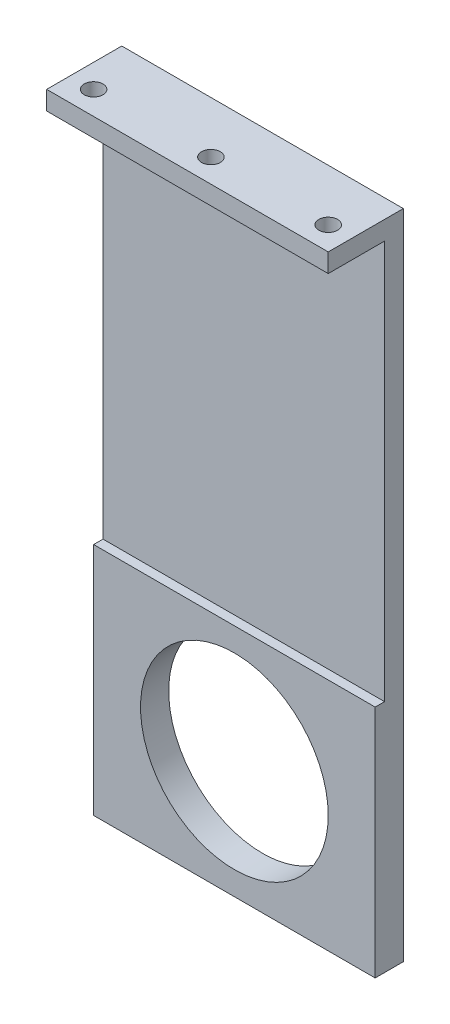
ISO-10303-21;
HEADER;
FILE_DESCRIPTION(('STEP AP214'),'2;1');
FILE_NAME('part.step','',(''),(''),'','','');
FILE_SCHEMA(('AUTOMOTIVE_DESIGN { 1 0 10303 214 1 1 1 1 }'));
ENDSEC;
DATA;
#1=APPLICATION_CONTEXT('core data for automotive mechanical design processes');
#2=APPLICATION_PROTOCOL_DEFINITION('international standard','automotive_design',2000,#1);
#3=PRODUCT_CONTEXT('',#1,'mechanical');
#4=PRODUCT('Part','Part','',(#3));
#5=PRODUCT_RELATED_PRODUCT_CATEGORY('part','',(#4));
#6=PRODUCT_DEFINITION_FORMATION('','',#4);
#7=PRODUCT_DEFINITION_CONTEXT('part definition',#1,'design');
#8=PRODUCT_DEFINITION('design','',#6,#7);
#9=PRODUCT_DEFINITION_SHAPE('','',#8);
#10=(LENGTH_UNIT() NAMED_UNIT(*) SI_UNIT(.MILLI.,.METRE.));
#11=(NAMED_UNIT(*) PLANE_ANGLE_UNIT() SI_UNIT($,.RADIAN.));
#12=(NAMED_UNIT(*) SI_UNIT($,.STERADIAN.) SOLID_ANGLE_UNIT());
#13=UNCERTAINTY_MEASURE_WITH_UNIT(LENGTH_MEASURE(1.E-05),#10,'distance_accuracy_value','');
#14=(GEOMETRIC_REPRESENTATION_CONTEXT(3) GLOBAL_UNCERTAINTY_ASSIGNED_CONTEXT((#13)) GLOBAL_UNIT_ASSIGNED_CONTEXT((#10,
#11,#12)) REPRESENTATION_CONTEXT('',''));
#15=CARTESIAN_POINT('',(0.,0.,0.));
#16=DIRECTION('',(0.,0.,1.));
#17=DIRECTION('',(1.,0.,0.));
#18=AXIS2_PLACEMENT_3D('',#15,#16,#17);
#19=CARTESIAN_POINT('',(-30.,0.,6.));
#20=DIRECTION('',(-1.,0.,0.));
#21=DIRECTION('',(0.,0.,1.));
#22=AXIS2_PLACEMENT_3D('',#19,#20,#21);
#23=PLANE('',#22);
#24=DIRECTION('',(0.,1.,0.));
#25=VECTOR('',#24,1.);
#26=CARTESIAN_POINT('',(-30.,0.,0.));
#27=LINE('',#26,#25);
#28=CARTESIAN_POINT('',(-30.,-25.,0.));
#29=VERTEX_POINT('',#28);
#30=CARTESIAN_POINT('',(-30.,114.,0.));
#31=VERTEX_POINT('',#30);
#32=EDGE_CURVE('E184',#29,#31,#27,.T.);
#33=ORIENTED_EDGE('',*,*,#32,.F.);
#34=DIRECTION('',(0.,0.,-1.));
#35=VECTOR('',#34,1.);
#36=CARTESIAN_POINT('',(-30.,-25.,6.));
#37=LINE('',#36,#35);
#38=CARTESIAN_POINT('',(-30.,-25.,6.));
#39=VERTEX_POINT('',#38);
#40=EDGE_CURVE('E11',#39,#29,#37,.T.);
#41=ORIENTED_EDGE('',*,*,#40,.F.);
#42=DIRECTION('',(0.,1.,0.));
#43=VECTOR('',#42,1.);
#44=CARTESIAN_POINT('',(-30.,0.,6.));
#45=LINE('',#44,#43);
#46=CARTESIAN_POINT('',(-30.,25.,6.));
#47=VERTEX_POINT('',#46);
#48=EDGE_CURVE('E167',#39,#47,#45,.T.);
#49=ORIENTED_EDGE('',*,*,#48,.T.);
#50=DIRECTION('',(0.,0.,-1.));
#51=VECTOR('',#50,1.);
#52=CARTESIAN_POINT('',(-30.,25.,6.));
#53=LINE('',#52,#51);
#54=CARTESIAN_POINT('',(-30.,25.,4.));
#55=VERTEX_POINT('',#54);
#56=EDGE_CURVE('E180',#47,#55,#53,.T.);
#57=ORIENTED_EDGE('',*,*,#56,.T.);
#58=DIRECTION('',(0.,1.,0.));
#59=VECTOR('',#58,1.);
#60=CARTESIAN_POINT('',(-30.,0.,4.));
#61=LINE('',#60,#59);
#62=CARTESIAN_POINT('',(-30.,110.,4.));
#63=VERTEX_POINT('',#62);
#64=EDGE_CURVE('E61',#55,#63,#61,.T.);
#65=ORIENTED_EDGE('',*,*,#64,.T.);
#66=DIRECTION('',(0.,0.,1.));
#67=VECTOR('',#66,1.);
#68=CARTESIAN_POINT('',(-30.,110.,0.));
#69=LINE('',#68,#67);
#70=CARTESIAN_POINT('',(-30.,110.,16.));
#71=VERTEX_POINT('',#70);
#72=EDGE_CURVE('E142',#63,#71,#69,.T.);
#73=ORIENTED_EDGE('',*,*,#72,.T.);
#74=DIRECTION('',(0.,-1.,0.));
#75=VECTOR('',#74,1.);
#76=CARTESIAN_POINT('',(-30.,114.,16.));
#77=LINE('',#76,#75);
#78=CARTESIAN_POINT('',(-30.,114.,16.));
#79=VERTEX_POINT('',#78);
#80=EDGE_CURVE('E122',#79,#71,#77,.T.);
#81=ORIENTED_EDGE('',*,*,#80,.F.);
#82=DIRECTION('',(0.,0.,1.));
#83=VECTOR('',#82,1.);
#84=CARTESIAN_POINT('',(-30.,114.,0.));
#85=LINE('',#84,#83);
#86=EDGE_CURVE('E130',#31,#79,#85,.T.);
#87=ORIENTED_EDGE('',*,*,#86,.F.);
#88=EDGE_LOOP('',(#33,#41,#49,#57,#65,#73,#81,#87));
#89=FACE_BOUND('',#88,.T.);
#90=ADVANCED_FACE('F45',(#89),#23,.T.);
#91=CARTESIAN_POINT('',(0.,-25.,6.));
#92=DIRECTION('',(0.,-1.,0.));
#93=DIRECTION('',(1.,0.,0.));
#94=AXIS2_PLACEMENT_3D('',#91,#92,#93);
#95=PLANE('',#94);
#96=DIRECTION('',(-1.,0.,0.));
#97=VECTOR('',#96,1.);
#98=CARTESIAN_POINT('',(0.,-25.,0.));
#99=LINE('',#98,#97);
#100=CARTESIAN_POINT('',(30.,-25.,0.));
#101=VERTEX_POINT('',#100);
#102=EDGE_CURVE('E187',#101,#29,#99,.T.);
#103=ORIENTED_EDGE('',*,*,#102,.F.);
#104=DIRECTION('',(0.,0.,-1.));
#105=VECTOR('',#104,1.);
#106=CARTESIAN_POINT('',(30.,-25.,6.));
#107=LINE('',#106,#105);
#108=CARTESIAN_POINT('',(30.,-25.,6.));
#109=VERTEX_POINT('',#108);
#110=EDGE_CURVE('E54',#109,#101,#107,.T.);
#111=ORIENTED_EDGE('',*,*,#110,.F.);
#112=DIRECTION('',(-1.,0.,0.));
#113=VECTOR('',#112,1.);
#114=CARTESIAN_POINT('',(0.,-25.,6.));
#115=LINE('',#114,#113);
#116=EDGE_CURVE('E171',#109,#39,#115,.T.);
#117=ORIENTED_EDGE('',*,*,#116,.T.);
#118=ORIENTED_EDGE('',*,*,#40,.T.);
#119=EDGE_LOOP('',(#103,#111,#117,#118));
#120=FACE_BOUND('',#119,.T.);
#121=ADVANCED_FACE('F224',(#120),#95,.T.);
#122=CARTESIAN_POINT('',(30.,0.,6.));
#123=DIRECTION('',(-1.,0.,0.));
#124=DIRECTION('',(0.,0.,1.));
#125=AXIS2_PLACEMENT_3D('',#122,#123,#124);
#126=PLANE('',#125);
#127=DIRECTION('',(0.,1.,0.));
#128=VECTOR('',#127,1.);
#129=CARTESIAN_POINT('',(30.,0.,0.));
#130=LINE('',#129,#128);
#131=CARTESIAN_POINT('',(30.,114.,0.));
#132=VERTEX_POINT('',#131);
#133=EDGE_CURVE('E168',#101,#132,#130,.T.);
#134=ORIENTED_EDGE('',*,*,#133,.T.);
#135=DIRECTION('',(0.,0.,-1.));
#136=VECTOR('',#135,1.);
#137=CARTESIAN_POINT('',(30.,114.,0.));
#138=LINE('',#137,#136);
#139=CARTESIAN_POINT('',(30.,114.,16.));
#140=VERTEX_POINT('',#139);
#141=EDGE_CURVE('E129',#140,#132,#138,.T.);
#142=ORIENTED_EDGE('',*,*,#141,.F.);
#143=DIRECTION('',(0.,-1.,0.));
#144=VECTOR('',#143,1.);
#145=CARTESIAN_POINT('',(30.,114.,16.));
#146=LINE('',#145,#144);
#147=CARTESIAN_POINT('',(30.,110.,16.));
#148=VERTEX_POINT('',#147);
#149=EDGE_CURVE('E124',#140,#148,#146,.T.);
#150=ORIENTED_EDGE('',*,*,#149,.T.);
#151=DIRECTION('',(0.,0.,-1.));
#152=VECTOR('',#151,1.);
#153=CARTESIAN_POINT('',(30.,110.,0.));
#154=LINE('',#153,#152);
#155=CARTESIAN_POINT('',(30.,110.,4.));
#156=VERTEX_POINT('',#155);
#157=EDGE_CURVE('E139',#148,#156,#154,.T.);
#158=ORIENTED_EDGE('',*,*,#157,.T.);
#159=DIRECTION('',(0.,1.,0.));
#160=VECTOR('',#159,1.);
#161=CARTESIAN_POINT('',(30.,0.,4.));
#162=LINE('',#161,#160);
#163=CARTESIAN_POINT('',(30.,25.,4.));
#164=VERTEX_POINT('',#163);
#165=EDGE_CURVE('E149',#164,#156,#162,.T.);
#166=ORIENTED_EDGE('',*,*,#165,.F.);
#167=DIRECTION('',(0.,0.,-1.));
#168=VECTOR('',#167,1.);
#169=CARTESIAN_POINT('',(30.,25.,6.));
#170=LINE('',#169,#168);
#171=CARTESIAN_POINT('',(30.,25.,6.));
#172=VERTEX_POINT('',#171);
#173=EDGE_CURVE('E196',#172,#164,#170,.T.);
#174=ORIENTED_EDGE('',*,*,#173,.F.);
#175=DIRECTION('',(0.,1.,0.));
#176=VECTOR('',#175,1.);
#177=CARTESIAN_POINT('',(30.,0.,6.));
#178=LINE('',#177,#176);
#179=EDGE_CURVE('E175',#109,#172,#178,.T.);
#180=ORIENTED_EDGE('',*,*,#179,.F.);
#181=ORIENTED_EDGE('',*,*,#110,.T.);
#182=EDGE_LOOP('',(#134,#142,#150,#158,#166,#174,#180,#181));
#183=FACE_BOUND('',#182,.T.);
#184=ADVANCED_FACE('F203',(#183),#126,.F.);
#185=CARTESIAN_POINT('',(0.,0.,6.));
#186=DIRECTION('',(0.,0.,-1.));
#187=DIRECTION('',(-1.,0.,0.));
#188=AXIS2_PLACEMENT_3D('',#185,#186,#187);
#189=CYLINDRICAL_SURFACE('',#188,20.);
#190=CARTESIAN_POINT('',(0.,0.,6.));
#191=DIRECTION('',(0.,0.,1.));
#192=DIRECTION('',(1.,0.,0.));
#193=AXIS2_PLACEMENT_3D('',#190,#191,#192);
#194=CIRCLE('',#193,20.);
#195=CARTESIAN_POINT('',(20.,0.,6.));
#196=VERTEX_POINT('',#195);
#197=EDGE_CURVE('E163',#196,#196,#194,.T.);
#198=ORIENTED_EDGE('',*,*,#197,.T.);
#199=EDGE_LOOP('',(#198));
#200=FACE_BOUND('',#199,.T.);
#201=CARTESIAN_POINT('',(0.,0.,0.));
#202=DIRECTION('',(0.,0.,1.));
#203=DIRECTION('',(1.,0.,0.));
#204=AXIS2_PLACEMENT_3D('',#201,#202,#203);
#205=CIRCLE('',#204,20.);
#206=CARTESIAN_POINT('',(20.,0.,0.));
#207=VERTEX_POINT('',#206);
#208=EDGE_CURVE('E162',#207,#207,#205,.T.);
#209=ORIENTED_EDGE('',*,*,#208,.F.);
#210=EDGE_LOOP('',(#209));
#211=FACE_BOUND('',#210,.T.);
#212=ADVANCED_FACE('F47',(#200,#211),#189,.F.);
#213=CARTESIAN_POINT('',(0.,25.,6.));
#214=DIRECTION('',(0.,-1.,0.));
#215=DIRECTION('',(0.,0.,-1.));
#216=AXIS2_PLACEMENT_3D('',#213,#214,#215);
#217=PLANE('',#216);
#218=ORIENTED_EDGE('',*,*,#173,.T.);
#219=DIRECTION('',(-1.,0.,0.));
#220=VECTOR('',#219,1.);
#221=CARTESIAN_POINT('',(0.,25.,4.));
#222=LINE('',#221,#220);
#223=EDGE_CURVE('E145',#164,#55,#222,.T.);
#224=ORIENTED_EDGE('',*,*,#223,.T.);
#225=ORIENTED_EDGE('',*,*,#56,.F.);
#226=DIRECTION('',(-1.,0.,0.));
#227=VECTOR('',#226,1.);
#228=CARTESIAN_POINT('',(0.,25.,6.));
#229=LINE('',#228,#227);
#230=EDGE_CURVE('E70',#172,#47,#229,.T.);
#231=ORIENTED_EDGE('',*,*,#230,.F.);
#232=EDGE_LOOP('',(#218,#224,#225,#231));
#233=FACE_BOUND('',#232,.T.);
#234=ADVANCED_FACE('F202',(#233),#217,.F.);
#235=CARTESIAN_POINT('',(0.,0.,6.));
#236=DIRECTION('',(0.,0.,1.));
#237=DIRECTION('',(1.,0.,0.));
#238=AXIS2_PLACEMENT_3D('',#235,#236,#237);
#239=PLANE('',#238);
#240=ORIENTED_EDGE('',*,*,#197,.F.);
#241=EDGE_LOOP('',(#240));
#242=FACE_BOUND('',#241,.T.);
#243=ORIENTED_EDGE('',*,*,#48,.F.);
#244=ORIENTED_EDGE('',*,*,#116,.F.);
#245=ORIENTED_EDGE('',*,*,#179,.T.);
#246=ORIENTED_EDGE('',*,*,#230,.T.);
#247=EDGE_LOOP('',(#243,#244,#245,#246));
#248=FACE_BOUND('',#247,.T.);
#249=ADVANCED_FACE('F218',(#242,#248),#239,.T.);
#250=CARTESIAN_POINT('',(0.,0.,0.));
#251=DIRECTION('',(0.,0.,1.));
#252=DIRECTION('',(1.,0.,0.));
#253=AXIS2_PLACEMENT_3D('',#250,#251,#252);
#254=PLANE('',#253);
#255=ORIENTED_EDGE('',*,*,#208,.T.);
#256=EDGE_LOOP('',(#255));
#257=FACE_BOUND('',#256,.T.);
#258=ORIENTED_EDGE('',*,*,#32,.T.);
#259=DIRECTION('',(-1.,0.,0.));
#260=VECTOR('',#259,1.);
#261=CARTESIAN_POINT('',(-30.,114.,0.));
#262=LINE('',#261,#260);
#263=EDGE_CURVE('E137',#132,#31,#262,.T.);
#264=ORIENTED_EDGE('',*,*,#263,.F.);
#265=ORIENTED_EDGE('',*,*,#133,.F.);
#266=ORIENTED_EDGE('',*,*,#102,.T.);
#267=EDGE_LOOP('',(#258,#264,#265,#266));
#268=FACE_BOUND('',#267,.T.);
#269=ADVANCED_FACE('F210',(#257,#268),#254,.F.);
#270=CARTESIAN_POINT('',(0.,0.,4.));
#271=DIRECTION('',(0.,0.,1.));
#272=DIRECTION('',(1.,0.,0.));
#273=AXIS2_PLACEMENT_3D('',#270,#271,#272);
#274=PLANE('',#273);
#275=ORIENTED_EDGE('',*,*,#223,.F.);
#276=ORIENTED_EDGE('',*,*,#165,.T.);
#277=DIRECTION('',(1.,0.,0.));
#278=VECTOR('',#277,1.);
#279=CARTESIAN_POINT('',(0.,110.,4.));
#280=LINE('',#279,#278);
#281=EDGE_CURVE('E156',#63,#156,#280,.T.);
#282=ORIENTED_EDGE('',*,*,#281,.F.);
#283=ORIENTED_EDGE('',*,*,#64,.F.);
#284=EDGE_LOOP('',(#275,#276,#282,#283));
#285=FACE_BOUND('',#284,.T.);
#286=ADVANCED_FACE('F207',(#285),#274,.T.);
#287=CARTESIAN_POINT('',(0.,110.,0.));
#288=DIRECTION('',(0.,1.,0.));
#289=DIRECTION('',(0.,0.,1.));
#290=AXIS2_PLACEMENT_3D('',#287,#288,#289);
#291=PLANE('',#290);
#292=CARTESIAN_POINT('',(-25.,110.,11.));
#293=DIRECTION('',(0.,1.,0.));
#294=DIRECTION('',(0.,0.,1.));
#295=AXIS2_PLACEMENT_3D('',#292,#293,#294);
#296=CIRCLE('',#295,2.);
#297=CARTESIAN_POINT('',(-25.,110.,13.));
#298=VERTEX_POINT('',#297);
#299=EDGE_CURVE('E255',#298,#298,#296,.T.);
#300=ORIENTED_EDGE('',*,*,#299,.T.);
#301=EDGE_LOOP('',(#300));
#302=FACE_BOUND('',#301,.T.);
#303=CARTESIAN_POINT('',(0.,110.,11.));
#304=DIRECTION('',(0.,1.,0.));
#305=DIRECTION('',(0.,0.,1.));
#306=AXIS2_PLACEMENT_3D('',#303,#304,#305);
#307=CIRCLE('',#306,2.);
#308=CARTESIAN_POINT('',(0.,110.,13.));
#309=VERTEX_POINT('',#308);
#310=EDGE_CURVE('E263',#309,#309,#307,.T.);
#311=ORIENTED_EDGE('',*,*,#310,.T.);
#312=EDGE_LOOP('',(#311));
#313=FACE_BOUND('',#312,.T.);
#314=CARTESIAN_POINT('',(25.,110.,11.));
#315=DIRECTION('',(0.,1.,0.));
#316=DIRECTION('',(0.,0.,1.));
#317=AXIS2_PLACEMENT_3D('',#314,#315,#316);
#318=CIRCLE('',#317,2.);
#319=CARTESIAN_POINT('',(25.,110.,13.));
#320=VERTEX_POINT('',#319);
#321=EDGE_CURVE('E271',#320,#320,#318,.T.);
#322=ORIENTED_EDGE('',*,*,#321,.T.);
#323=EDGE_LOOP('',(#322));
#324=FACE_BOUND('',#323,.T.);
#325=ORIENTED_EDGE('',*,*,#72,.F.);
#326=ORIENTED_EDGE('',*,*,#281,.T.);
#327=ORIENTED_EDGE('',*,*,#157,.F.);
#328=DIRECTION('',(1.,0.,0.));
#329=VECTOR('',#328,1.);
#330=CARTESIAN_POINT('',(-30.,110.,16.));
#331=LINE('',#330,#329);
#332=EDGE_CURVE('E248',#71,#148,#331,.T.);
#333=ORIENTED_EDGE('',*,*,#332,.F.);
#334=EDGE_LOOP('',(#325,#326,#327,#333));
#335=FACE_BOUND('',#334,.T.);
#336=ADVANCED_FACE('F209',(#302,#313,#324,#335),#291,.F.);
#337=CARTESIAN_POINT('',(0.,114.,0.));
#338=DIRECTION('',(0.,1.,0.));
#339=DIRECTION('',(0.,0.,1.));
#340=AXIS2_PLACEMENT_3D('',#337,#338,#339);
#341=PLANE('',#340);
#342=CARTESIAN_POINT('',(0.,114.,11.));
#343=DIRECTION('',(0.,1.,0.));
#344=DIRECTION('',(0.,0.,1.));
#345=AXIS2_PLACEMENT_3D('',#342,#343,#344);
#346=CIRCLE('',#345,2.);
#347=CARTESIAN_POINT('',(0.,114.,13.));
#348=VERTEX_POINT('',#347);
#349=EDGE_CURVE('E259',#348,#348,#346,.T.);
#350=ORIENTED_EDGE('',*,*,#349,.F.);
#351=EDGE_LOOP('',(#350));
#352=FACE_BOUND('',#351,.T.);
#353=ORIENTED_EDGE('',*,*,#86,.T.);
#354=DIRECTION('',(1.,0.,0.));
#355=VECTOR('',#354,1.);
#356=CARTESIAN_POINT('',(-30.,114.,16.));
#357=LINE('',#356,#355);
#358=EDGE_CURVE('E118',#79,#140,#357,.T.);
#359=ORIENTED_EDGE('',*,*,#358,.T.);
#360=ORIENTED_EDGE('',*,*,#141,.T.);
#361=ORIENTED_EDGE('',*,*,#263,.T.);
#362=EDGE_LOOP('',(#353,#359,#360,#361));
#363=FACE_BOUND('',#362,.T.);
#364=CARTESIAN_POINT('',(-25.,114.,11.));
#365=DIRECTION('',(0.,1.,0.));
#366=DIRECTION('',(0.,0.,1.));
#367=AXIS2_PLACEMENT_3D('',#364,#365,#366);
#368=CIRCLE('',#367,2.);
#369=CARTESIAN_POINT('',(-25.,114.,13.));
#370=VERTEX_POINT('',#369);
#371=EDGE_CURVE('E249',#370,#370,#368,.T.);
#372=ORIENTED_EDGE('',*,*,#371,.F.);
#373=EDGE_LOOP('',(#372));
#374=FACE_BOUND('',#373,.T.);
#375=CARTESIAN_POINT('',(25.,114.,11.));
#376=DIRECTION('',(0.,1.,0.));
#377=DIRECTION('',(0.,0.,1.));
#378=AXIS2_PLACEMENT_3D('',#375,#376,#377);
#379=CIRCLE('',#378,2.);
#380=CARTESIAN_POINT('',(25.,114.,13.));
#381=VERTEX_POINT('',#380);
#382=EDGE_CURVE('E267',#381,#381,#379,.T.);
#383=ORIENTED_EDGE('',*,*,#382,.F.);
#384=EDGE_LOOP('',(#383));
#385=FACE_BOUND('',#384,.T.);
#386=ADVANCED_FACE('F134',(#352,#363,#374,#385),#341,.T.);
#387=CARTESIAN_POINT('',(-30.,114.,16.));
#388=DIRECTION('',(0.,0.,-1.));
#389=DIRECTION('',(-1.,0.,0.));
#390=AXIS2_PLACEMENT_3D('',#387,#388,#389);
#391=PLANE('',#390);
#392=ORIENTED_EDGE('',*,*,#332,.T.);
#393=ORIENTED_EDGE('',*,*,#149,.F.);
#394=ORIENTED_EDGE('',*,*,#358,.F.);
#395=ORIENTED_EDGE('',*,*,#80,.T.);
#396=EDGE_LOOP('',(#392,#393,#394,#395));
#397=FACE_BOUND('',#396,.T.);
#398=ADVANCED_FACE('F120',(#397),#391,.F.);
#399=CARTESIAN_POINT('',(-25.,114.,11.));
#400=DIRECTION('',(0.,-1.,0.));
#401=DIRECTION('',(0.,0.,-1.));
#402=AXIS2_PLACEMENT_3D('',#399,#400,#401);
#403=CYLINDRICAL_SURFACE('',#402,2.);
#404=ORIENTED_EDGE('',*,*,#371,.T.);
#405=EDGE_LOOP('',(#404));
#406=FACE_BOUND('',#405,.T.);
#407=ORIENTED_EDGE('',*,*,#299,.F.);
#408=EDGE_LOOP('',(#407));
#409=FACE_BOUND('',#408,.T.);
#410=ADVANCED_FACE('F287',(#406,#409),#403,.F.);
#411=CARTESIAN_POINT('',(0.,114.,11.));
#412=DIRECTION('',(0.,-1.,0.));
#413=DIRECTION('',(0.,0.,-1.));
#414=AXIS2_PLACEMENT_3D('',#411,#412,#413);
#415=CYLINDRICAL_SURFACE('',#414,2.);
#416=ORIENTED_EDGE('',*,*,#349,.T.);
#417=EDGE_LOOP('',(#416));
#418=FACE_BOUND('',#417,.T.);
#419=ORIENTED_EDGE('',*,*,#310,.F.);
#420=EDGE_LOOP('',(#419));
#421=FACE_BOUND('',#420,.T.);
#422=ADVANCED_FACE('F281',(#418,#421),#415,.F.);
#423=CARTESIAN_POINT('',(25.,114.,11.));
#424=DIRECTION('',(0.,-1.,0.));
#425=DIRECTION('',(0.,0.,-1.));
#426=AXIS2_PLACEMENT_3D('',#423,#424,#425);
#427=CYLINDRICAL_SURFACE('',#426,2.);
#428=ORIENTED_EDGE('',*,*,#382,.T.);
#429=EDGE_LOOP('',(#428));
#430=FACE_BOUND('',#429,.T.);
#431=ORIENTED_EDGE('',*,*,#321,.F.);
#432=EDGE_LOOP('',(#431));
#433=FACE_BOUND('',#432,.T.);
#434=ADVANCED_FACE('F279',(#430,#433),#427,.F.);
#435=CLOSED_SHELL('',(#90,#121,#184,#212,#234,#249,#269,#286,#336,#386,#398,#410,#422,#434));
#436=MANIFOLD_SOLID_BREP('B2',#435);
#437=ADVANCED_BREP_SHAPE_REPRESENTATION('',(#18,#436),#14);
#438=SHAPE_DEFINITION_REPRESENTATION(#9,#437);
ENDSEC;
END-ISO-10303-21;
